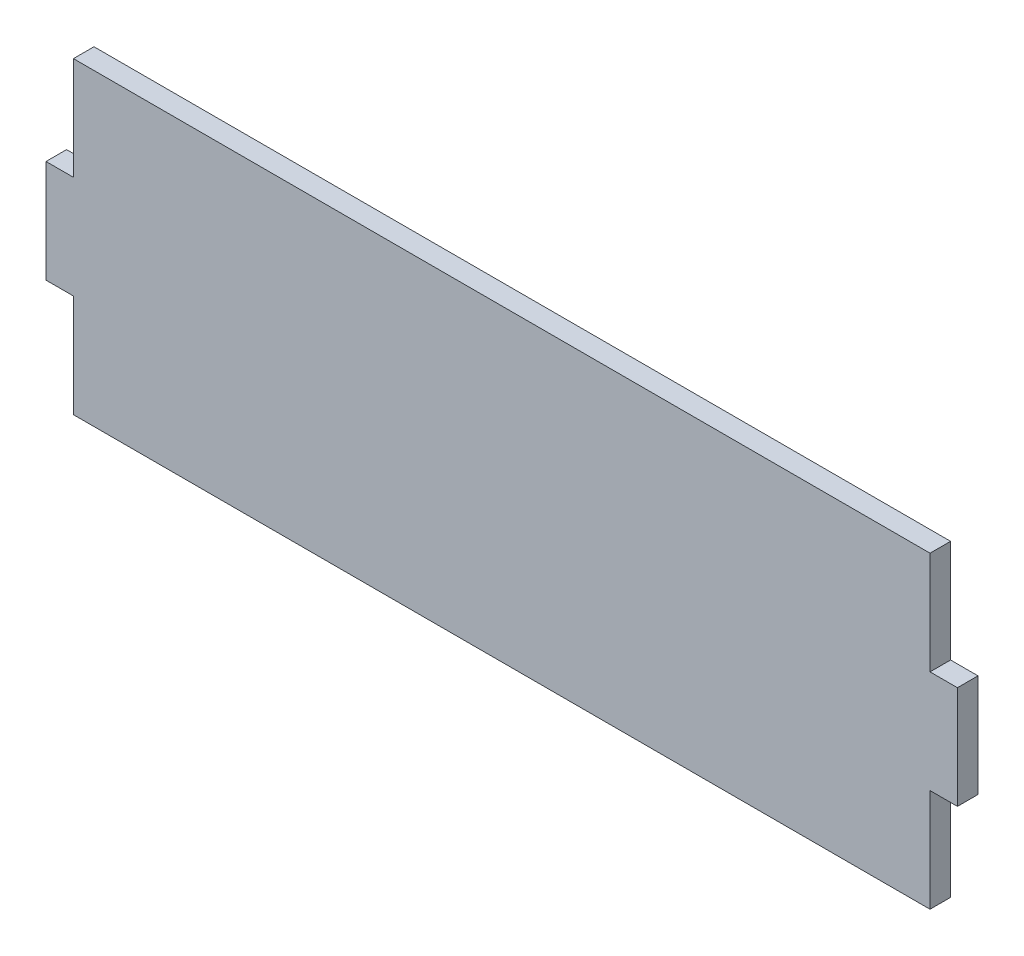
ISO-10303-21;
HEADER;
FILE_DESCRIPTION(('STEP AP214'),'2;1');
FILE_NAME('part.step','',(''),(''),'','','');
FILE_SCHEMA(('AUTOMOTIVE_DESIGN { 1 0 10303 214 1 1 1 1 }'));
ENDSEC;
DATA;
#1=APPLICATION_CONTEXT('core data for automotive mechanical design processes');
#2=APPLICATION_PROTOCOL_DEFINITION('international standard','automotive_design',2000,#1);
#3=PRODUCT_CONTEXT('',#1,'mechanical');
#4=PRODUCT('Part','Part','',(#3));
#5=PRODUCT_RELATED_PRODUCT_CATEGORY('part','',(#4));
#6=PRODUCT_DEFINITION_FORMATION('','',#4);
#7=PRODUCT_DEFINITION_CONTEXT('part definition',#1,'design');
#8=PRODUCT_DEFINITION('design','',#6,#7);
#9=PRODUCT_DEFINITION_SHAPE('','',#8);
#10=(LENGTH_UNIT() NAMED_UNIT(*) SI_UNIT(.MILLI.,.METRE.));
#11=(NAMED_UNIT(*) PLANE_ANGLE_UNIT() SI_UNIT($,.RADIAN.));
#12=(NAMED_UNIT(*) SI_UNIT($,.STERADIAN.) SOLID_ANGLE_UNIT());
#13=UNCERTAINTY_MEASURE_WITH_UNIT(LENGTH_MEASURE(1.E-05),#10,'distance_accuracy_value','');
#14=(GEOMETRIC_REPRESENTATION_CONTEXT(3) GLOBAL_UNCERTAINTY_ASSIGNED_CONTEXT((#13)) GLOBAL_UNIT_ASSIGNED_CONTEXT((#10,
#11,#12)) REPRESENTATION_CONTEXT('',''));
#15=CARTESIAN_POINT('',(0.,0.,0.));
#16=DIRECTION('',(0.,0.,1.));
#17=DIRECTION('',(1.,0.,0.));
#18=AXIS2_PLACEMENT_3D('',#15,#16,#17);
#19=CARTESIAN_POINT('',(0.,0.,3.));
#20=DIRECTION('',(-1.,0.,0.));
#21=DIRECTION('',(0.,0.,1.));
#22=AXIS2_PLACEMENT_3D('',#19,#20,#21);
#23=PLANE('',#22);
#24=DIRECTION('',(0.,0.,1.));
#25=VECTOR('',#24,1.);
#26=CARTESIAN_POINT('',(0.,30.,0.));
#27=LINE('',#26,#25);
#28=CARTESIAN_POINT('',(0.,30.,0.));
#29=VERTEX_POINT('',#28);
#30=CARTESIAN_POINT('',(0.,30.,3.));
#31=VERTEX_POINT('',#30);
#32=EDGE_CURVE('E156',#29,#31,#27,.T.);
#33=ORIENTED_EDGE('',*,*,#32,.F.);
#34=DIRECTION('',(0.,1.,0.));
#35=VECTOR('',#34,1.);
#36=CARTESIAN_POINT('',(0.,0.,0.));
#37=LINE('',#36,#35);
#38=CARTESIAN_POINT('',(0.,45.,0.));
#39=VERTEX_POINT('',#38);
#40=EDGE_CURVE('E152',#29,#39,#37,.T.);
#41=ORIENTED_EDGE('',*,*,#40,.T.);
#42=DIRECTION('',(0.,0.,-1.));
#43=VECTOR('',#42,1.);
#44=CARTESIAN_POINT('',(0.,45.,3.));
#45=LINE('',#44,#43);
#46=CARTESIAN_POINT('',(0.,45.,3.));
#47=VERTEX_POINT('',#46);
#48=EDGE_CURVE('E11',#47,#39,#45,.T.);
#49=ORIENTED_EDGE('',*,*,#48,.F.);
#50=DIRECTION('',(0.,1.,0.));
#51=VECTOR('',#50,1.);
#52=CARTESIAN_POINT('',(0.,0.,3.));
#53=LINE('',#52,#51);
#54=EDGE_CURVE('E166',#31,#47,#53,.T.);
#55=ORIENTED_EDGE('',*,*,#54,.F.);
#56=EDGE_LOOP('',(#33,#41,#49,#55));
#57=FACE_BOUND('',#56,.T.);
#58=ADVANCED_FACE('F39',(#57),#23,.F.);
#59=CARTESIAN_POINT('',(-125.,0.,3.));
#60=DIRECTION('',(1.,0.,0.));
#61=DIRECTION('',(0.,0.,-1.));
#62=AXIS2_PLACEMENT_3D('',#59,#60,#61);
#63=PLANE('',#62);
#64=DIRECTION('',(0.,0.,1.));
#65=VECTOR('',#64,1.);
#66=CARTESIAN_POINT('',(-125.,15.,0.));
#67=LINE('',#66,#65);
#68=CARTESIAN_POINT('',(-125.,15.,0.));
#69=VERTEX_POINT('',#68);
#70=CARTESIAN_POINT('',(-125.,15.,3.));
#71=VERTEX_POINT('',#70);
#72=EDGE_CURVE('E235',#69,#71,#67,.T.);
#73=ORIENTED_EDGE('',*,*,#72,.F.);
#74=DIRECTION('',(0.,-1.,0.));
#75=VECTOR('',#74,1.);
#76=CARTESIAN_POINT('',(-125.,0.,0.));
#77=LINE('',#76,#75);
#78=CARTESIAN_POINT('',(-125.,0.,0.));
#79=VERTEX_POINT('',#78);
#80=EDGE_CURVE('E154',#69,#79,#77,.T.);
#81=ORIENTED_EDGE('',*,*,#80,.T.);
#82=DIRECTION('',(0.,0.,-1.));
#83=VECTOR('',#82,1.);
#84=CARTESIAN_POINT('',(-125.,0.,3.));
#85=LINE('',#84,#83);
#86=CARTESIAN_POINT('',(-125.,0.,3.));
#87=VERTEX_POINT('',#86);
#88=EDGE_CURVE('E168',#87,#79,#85,.T.);
#89=ORIENTED_EDGE('',*,*,#88,.F.);
#90=DIRECTION('',(0.,-1.,0.));
#91=VECTOR('',#90,1.);
#92=CARTESIAN_POINT('',(-125.,0.,3.));
#93=LINE('',#92,#91);
#94=EDGE_CURVE('E201',#71,#87,#93,.T.);
#95=ORIENTED_EDGE('',*,*,#94,.F.);
#96=EDGE_LOOP('',(#73,#81,#89,#95));
#97=FACE_BOUND('',#96,.T.);
#98=ADVANCED_FACE('F211',(#97),#63,.F.);
#99=CARTESIAN_POINT('',(0.,0.,0.));
#100=VERTEX_POINT('',#99);
#101=CARTESIAN_POINT('',(0.,15.,0.));
#102=VERTEX_POINT('',#101);
#103=EDGE_CURVE('E142',#100,#102,#37,.T.);
#104=ORIENTED_EDGE('',*,*,#103,.T.);
#105=DIRECTION('',(0.,0.,1.));
#106=VECTOR('',#105,1.);
#107=CARTESIAN_POINT('',(0.,15.,0.));
#108=LINE('',#107,#106);
#109=CARTESIAN_POINT('',(0.,15.,3.));
#110=VERTEX_POINT('',#109);
#111=EDGE_CURVE('E126',#102,#110,#108,.T.);
#112=ORIENTED_EDGE('',*,*,#111,.T.);
#113=CARTESIAN_POINT('',(0.,0.,3.));
#114=VERTEX_POINT('',#113);
#115=EDGE_CURVE('E198',#114,#110,#53,.T.);
#116=ORIENTED_EDGE('',*,*,#115,.F.);
#117=DIRECTION('',(0.,0.,-1.));
#118=VECTOR('',#117,1.);
#119=CARTESIAN_POINT('',(0.,0.,3.));
#120=LINE('',#119,#118);
#121=EDGE_CURVE('E150',#114,#100,#120,.T.);
#122=ORIENTED_EDGE('',*,*,#121,.T.);
#123=EDGE_LOOP('',(#104,#112,#116,#122));
#124=FACE_BOUND('',#123,.T.);
#125=ADVANCED_FACE('F41',(#124),#23,.F.);
#126=CARTESIAN_POINT('',(0.,45.,3.));
#127=DIRECTION('',(0.,-1.,0.));
#128=DIRECTION('',(1.,0.,0.));
#129=AXIS2_PLACEMENT_3D('',#126,#127,#128);
#130=PLANE('',#129);
#131=DIRECTION('',(-1.,0.,0.));
#132=VECTOR('',#131,1.);
#133=CARTESIAN_POINT('',(0.,45.,0.));
#134=LINE('',#133,#132);
#135=CARTESIAN_POINT('',(-125.,45.,0.));
#136=VERTEX_POINT('',#135);
#137=EDGE_CURVE('E151',#39,#136,#134,.T.);
#138=ORIENTED_EDGE('',*,*,#137,.T.);
#139=DIRECTION('',(0.,0.,-1.));
#140=VECTOR('',#139,1.);
#141=CARTESIAN_POINT('',(-125.,45.,3.));
#142=LINE('',#141,#140);
#143=CARTESIAN_POINT('',(-125.,45.,3.));
#144=VERTEX_POINT('',#143);
#145=EDGE_CURVE('E47',#144,#136,#142,.T.);
#146=ORIENTED_EDGE('',*,*,#145,.F.);
#147=DIRECTION('',(-1.,0.,0.));
#148=VECTOR('',#147,1.);
#149=CARTESIAN_POINT('',(0.,45.,3.));
#150=LINE('',#149,#148);
#151=EDGE_CURVE('E200',#47,#144,#150,.T.);
#152=ORIENTED_EDGE('',*,*,#151,.F.);
#153=ORIENTED_EDGE('',*,*,#48,.T.);
#154=EDGE_LOOP('',(#138,#146,#152,#153));
#155=FACE_BOUND('',#154,.T.);
#156=ADVANCED_FACE('F264',(#155),#130,.F.);
#157=CARTESIAN_POINT('',(-125.,30.,0.));
#158=VERTEX_POINT('',#157);
#159=EDGE_CURVE('E161',#136,#158,#77,.T.);
#160=ORIENTED_EDGE('',*,*,#159,.T.);
#161=DIRECTION('',(0.,0.,1.));
#162=VECTOR('',#161,1.);
#163=CARTESIAN_POINT('',(-125.,30.,0.));
#164=LINE('',#163,#162);
#165=CARTESIAN_POINT('',(-125.,30.,3.));
#166=VERTEX_POINT('',#165);
#167=EDGE_CURVE('E237',#158,#166,#164,.T.);
#168=ORIENTED_EDGE('',*,*,#167,.T.);
#169=EDGE_CURVE('E177',#144,#166,#93,.T.);
#170=ORIENTED_EDGE('',*,*,#169,.F.);
#171=ORIENTED_EDGE('',*,*,#145,.T.);
#172=EDGE_LOOP('',(#160,#168,#170,#171));
#173=FACE_BOUND('',#172,.T.);
#174=ADVANCED_FACE('F175',(#173),#63,.F.);
#175=CARTESIAN_POINT('',(0.,0.,3.));
#176=DIRECTION('',(0.,1.,0.));
#177=DIRECTION('',(0.,0.,1.));
#178=AXIS2_PLACEMENT_3D('',#175,#176,#177);
#179=PLANE('',#178);
#180=DIRECTION('',(1.,0.,0.));
#181=VECTOR('',#180,1.);
#182=CARTESIAN_POINT('',(0.,0.,0.));
#183=LINE('',#182,#181);
#184=EDGE_CURVE('E164',#79,#100,#183,.T.);
#185=ORIENTED_EDGE('',*,*,#184,.T.);
#186=ORIENTED_EDGE('',*,*,#121,.F.);
#187=DIRECTION('',(1.,0.,0.));
#188=VECTOR('',#187,1.);
#189=CARTESIAN_POINT('',(0.,0.,3.));
#190=LINE('',#189,#188);
#191=EDGE_CURVE('E158',#87,#114,#190,.T.);
#192=ORIENTED_EDGE('',*,*,#191,.F.);
#193=ORIENTED_EDGE('',*,*,#88,.T.);
#194=EDGE_LOOP('',(#185,#186,#192,#193));
#195=FACE_BOUND('',#194,.T.);
#196=ADVANCED_FACE('F214',(#195),#179,.F.);
#197=CARTESIAN_POINT('',(0.,0.,3.));
#198=DIRECTION('',(0.,0.,1.));
#199=DIRECTION('',(1.,0.,0.));
#200=AXIS2_PLACEMENT_3D('',#197,#198,#199);
#201=PLANE('',#200);
#202=ORIENTED_EDGE('',*,*,#115,.T.);
#203=DIRECTION('',(1.,0.,0.));
#204=VECTOR('',#203,1.);
#205=CARTESIAN_POINT('',(0.,15.,3.));
#206=LINE('',#205,#204);
#207=CARTESIAN_POINT('',(4.,15.,3.));
#208=VERTEX_POINT('',#207);
#209=EDGE_CURVE('E54',#110,#208,#206,.T.);
#210=ORIENTED_EDGE('',*,*,#209,.T.);
#211=DIRECTION('',(0.,1.,0.));
#212=VECTOR('',#211,1.);
#213=CARTESIAN_POINT('',(4.,15.,3.));
#214=LINE('',#213,#212);
#215=CARTESIAN_POINT('',(4.,30.,3.));
#216=VERTEX_POINT('',#215);
#217=EDGE_CURVE('E218',#208,#216,#214,.T.);
#218=ORIENTED_EDGE('',*,*,#217,.T.);
#219=DIRECTION('',(-1.,0.,0.));
#220=VECTOR('',#219,1.);
#221=CARTESIAN_POINT('',(0.,30.,3.));
#222=LINE('',#221,#220);
#223=EDGE_CURVE('E146',#216,#31,#222,.T.);
#224=ORIENTED_EDGE('',*,*,#223,.T.);
#225=ORIENTED_EDGE('',*,*,#54,.T.);
#226=ORIENTED_EDGE('',*,*,#151,.T.);
#227=ORIENTED_EDGE('',*,*,#169,.T.);
#228=DIRECTION('',(-1.,0.,0.));
#229=VECTOR('',#228,1.);
#230=CARTESIAN_POINT('',(-125.,30.,3.));
#231=LINE('',#230,#229);
#232=CARTESIAN_POINT('',(-129.,30.,3.));
#233=VERTEX_POINT('',#232);
#234=EDGE_CURVE('E62',#166,#233,#231,.T.);
#235=ORIENTED_EDGE('',*,*,#234,.T.);
#236=DIRECTION('',(0.,-1.,0.));
#237=VECTOR('',#236,1.);
#238=CARTESIAN_POINT('',(-129.,15.,3.));
#239=LINE('',#238,#237);
#240=CARTESIAN_POINT('',(-129.,15.,3.));
#241=VERTEX_POINT('',#240);
#242=EDGE_CURVE('E192',#233,#241,#239,.T.);
#243=ORIENTED_EDGE('',*,*,#242,.T.);
#244=DIRECTION('',(1.,0.,0.));
#245=VECTOR('',#244,1.);
#246=CARTESIAN_POINT('',(-125.,15.,3.));
#247=LINE('',#246,#245);
#248=EDGE_CURVE('E189',#241,#71,#247,.T.);
#249=ORIENTED_EDGE('',*,*,#248,.T.);
#250=ORIENTED_EDGE('',*,*,#94,.T.);
#251=ORIENTED_EDGE('',*,*,#191,.T.);
#252=EDGE_LOOP('',(#202,#210,#218,#224,#225,#226,#227,#235,#243,#249,#250,#251));
#253=FACE_BOUND('',#252,.T.);
#254=ADVANCED_FACE('F205',(#253),#201,.T.);
#255=CARTESIAN_POINT('',(0.,0.,0.));
#256=DIRECTION('',(0.,0.,1.));
#257=DIRECTION('',(1.,0.,0.));
#258=AXIS2_PLACEMENT_3D('',#255,#256,#257);
#259=PLANE('',#258);
#260=ORIENTED_EDGE('',*,*,#103,.F.);
#261=ORIENTED_EDGE('',*,*,#184,.F.);
#262=ORIENTED_EDGE('',*,*,#80,.F.);
#263=DIRECTION('',(1.,0.,0.));
#264=VECTOR('',#263,1.);
#265=CARTESIAN_POINT('',(-125.,15.,0.));
#266=LINE('',#265,#264);
#267=CARTESIAN_POINT('',(-129.,15.,0.));
#268=VERTEX_POINT('',#267);
#269=EDGE_CURVE('E194',#268,#69,#266,.T.);
#270=ORIENTED_EDGE('',*,*,#269,.F.);
#271=DIRECTION('',(0.,-1.,0.));
#272=VECTOR('',#271,1.);
#273=CARTESIAN_POINT('',(-129.,15.,0.));
#274=LINE('',#273,#272);
#275=CARTESIAN_POINT('',(-129.,30.,0.));
#276=VERTEX_POINT('',#275);
#277=EDGE_CURVE('E188',#276,#268,#274,.T.);
#278=ORIENTED_EDGE('',*,*,#277,.F.);
#279=DIRECTION('',(-1.,0.,0.));
#280=VECTOR('',#279,1.);
#281=CARTESIAN_POINT('',(-125.,30.,0.));
#282=LINE('',#281,#280);
#283=EDGE_CURVE('E185',#158,#276,#282,.T.);
#284=ORIENTED_EDGE('',*,*,#283,.F.);
#285=ORIENTED_EDGE('',*,*,#159,.F.);
#286=ORIENTED_EDGE('',*,*,#137,.F.);
#287=ORIENTED_EDGE('',*,*,#40,.F.);
#288=DIRECTION('',(-1.,0.,0.));
#289=VECTOR('',#288,1.);
#290=CARTESIAN_POINT('',(0.,30.,0.));
#291=LINE('',#290,#289);
#292=CARTESIAN_POINT('',(4.,30.,0.));
#293=VERTEX_POINT('',#292);
#294=EDGE_CURVE('E135',#293,#29,#291,.T.);
#295=ORIENTED_EDGE('',*,*,#294,.F.);
#296=DIRECTION('',(0.,1.,0.));
#297=VECTOR('',#296,1.);
#298=CARTESIAN_POINT('',(4.,15.,0.));
#299=LINE('',#298,#297);
#300=CARTESIAN_POINT('',(4.,15.,0.));
#301=VERTEX_POINT('',#300);
#302=EDGE_CURVE('E145',#301,#293,#299,.T.);
#303=ORIENTED_EDGE('',*,*,#302,.F.);
#304=DIRECTION('',(1.,0.,0.));
#305=VECTOR('',#304,1.);
#306=CARTESIAN_POINT('',(0.,15.,0.));
#307=LINE('',#306,#305);
#308=EDGE_CURVE('E129',#102,#301,#307,.T.);
#309=ORIENTED_EDGE('',*,*,#308,.F.);
#310=EDGE_LOOP('',(#260,#261,#262,#270,#278,#284,#285,#286,#287,#295,#303,#309));
#311=FACE_BOUND('',#310,.T.);
#312=ADVANCED_FACE('F140',(#311),#259,.F.);
#313=CARTESIAN_POINT('',(-125.,30.,0.));
#314=DIRECTION('',(0.,1.,0.));
#315=DIRECTION('',(0.,0.,1.));
#316=AXIS2_PLACEMENT_3D('',#313,#314,#315);
#317=PLANE('',#316);
#318=ORIENTED_EDGE('',*,*,#234,.F.);
#319=ORIENTED_EDGE('',*,*,#167,.F.);
#320=ORIENTED_EDGE('',*,*,#283,.T.);
#321=DIRECTION('',(0.,0.,1.));
#322=VECTOR('',#321,1.);
#323=CARTESIAN_POINT('',(-129.,30.,0.));
#324=LINE('',#323,#322);
#325=EDGE_CURVE('E231',#276,#233,#324,.T.);
#326=ORIENTED_EDGE('',*,*,#325,.T.);
#327=EDGE_LOOP('',(#318,#319,#320,#326));
#328=FACE_BOUND('',#327,.T.);
#329=ADVANCED_FACE('F244',(#328),#317,.T.);
#330=CARTESIAN_POINT('',(-125.,15.,0.));
#331=DIRECTION('',(0.,-1.,0.));
#332=DIRECTION('',(0.,0.,-1.));
#333=AXIS2_PLACEMENT_3D('',#330,#331,#332);
#334=PLANE('',#333);
#335=ORIENTED_EDGE('',*,*,#248,.F.);
#336=DIRECTION('',(0.,0.,1.));
#337=VECTOR('',#336,1.);
#338=CARTESIAN_POINT('',(-129.,15.,0.));
#339=LINE('',#338,#337);
#340=EDGE_CURVE('E233',#268,#241,#339,.T.);
#341=ORIENTED_EDGE('',*,*,#340,.F.);
#342=ORIENTED_EDGE('',*,*,#269,.T.);
#343=ORIENTED_EDGE('',*,*,#72,.T.);
#344=EDGE_LOOP('',(#335,#341,#342,#343));
#345=FACE_BOUND('',#344,.T.);
#346=ADVANCED_FACE('F240',(#345),#334,.T.);
#347=CARTESIAN_POINT('',(-129.,15.,0.));
#348=DIRECTION('',(-1.,0.,0.));
#349=DIRECTION('',(0.,0.,1.));
#350=AXIS2_PLACEMENT_3D('',#347,#348,#349);
#351=PLANE('',#350);
#352=ORIENTED_EDGE('',*,*,#242,.F.);
#353=ORIENTED_EDGE('',*,*,#325,.F.);
#354=ORIENTED_EDGE('',*,*,#277,.T.);
#355=ORIENTED_EDGE('',*,*,#340,.T.);
#356=EDGE_LOOP('',(#352,#353,#354,#355));
#357=FACE_BOUND('',#356,.T.);
#358=ADVANCED_FACE('F243',(#357),#351,.T.);
#359=CARTESIAN_POINT('',(0.,30.,0.));
#360=DIRECTION('',(0.,1.,0.));
#361=DIRECTION('',(0.,0.,1.));
#362=AXIS2_PLACEMENT_3D('',#359,#360,#361);
#363=PLANE('',#362);
#364=ORIENTED_EDGE('',*,*,#223,.F.);
#365=DIRECTION('',(0.,0.,1.));
#366=VECTOR('',#365,1.);
#367=CARTESIAN_POINT('',(4.,30.,0.));
#368=LINE('',#367,#366);
#369=EDGE_CURVE('E228',#293,#216,#368,.T.);
#370=ORIENTED_EDGE('',*,*,#369,.F.);
#371=ORIENTED_EDGE('',*,*,#294,.T.);
#372=ORIENTED_EDGE('',*,*,#32,.T.);
#373=EDGE_LOOP('',(#364,#370,#371,#372));
#374=FACE_BOUND('',#373,.T.);
#375=ADVANCED_FACE('F275',(#374),#363,.T.);
#376=CARTESIAN_POINT('',(4.,15.,0.));
#377=DIRECTION('',(1.,0.,0.));
#378=DIRECTION('',(0.,0.,-1.));
#379=AXIS2_PLACEMENT_3D('',#376,#377,#378);
#380=PLANE('',#379);
#381=ORIENTED_EDGE('',*,*,#217,.F.);
#382=DIRECTION('',(0.,0.,1.));
#383=VECTOR('',#382,1.);
#384=CARTESIAN_POINT('',(4.,15.,0.));
#385=LINE('',#384,#383);
#386=EDGE_CURVE('E134',#301,#208,#385,.T.);
#387=ORIENTED_EDGE('',*,*,#386,.F.);
#388=ORIENTED_EDGE('',*,*,#302,.T.);
#389=ORIENTED_EDGE('',*,*,#369,.T.);
#390=EDGE_LOOP('',(#381,#387,#388,#389));
#391=FACE_BOUND('',#390,.T.);
#392=ADVANCED_FACE('F279',(#391),#380,.T.);
#393=CARTESIAN_POINT('',(0.,15.,0.));
#394=DIRECTION('',(0.,-1.,0.));
#395=DIRECTION('',(0.,0.,-1.));
#396=AXIS2_PLACEMENT_3D('',#393,#394,#395);
#397=PLANE('',#396);
#398=ORIENTED_EDGE('',*,*,#209,.F.);
#399=ORIENTED_EDGE('',*,*,#111,.F.);
#400=ORIENTED_EDGE('',*,*,#308,.T.);
#401=ORIENTED_EDGE('',*,*,#386,.T.);
#402=EDGE_LOOP('',(#398,#399,#400,#401));
#403=FACE_BOUND('',#402,.T.);
#404=ADVANCED_FACE('F128',(#403),#397,.T.);
#405=CLOSED_SHELL('',(#58,#98,#125,#156,#174,#196,#254,#312,#329,#346,#358,#375,#392,#404));
#406=MANIFOLD_SOLID_BREP('B2',#405);
#407=ADVANCED_BREP_SHAPE_REPRESENTATION('',(#18,#406),#14);
#408=SHAPE_DEFINITION_REPRESENTATION(#9,#407);
ENDSEC;
END-ISO-10303-21;
